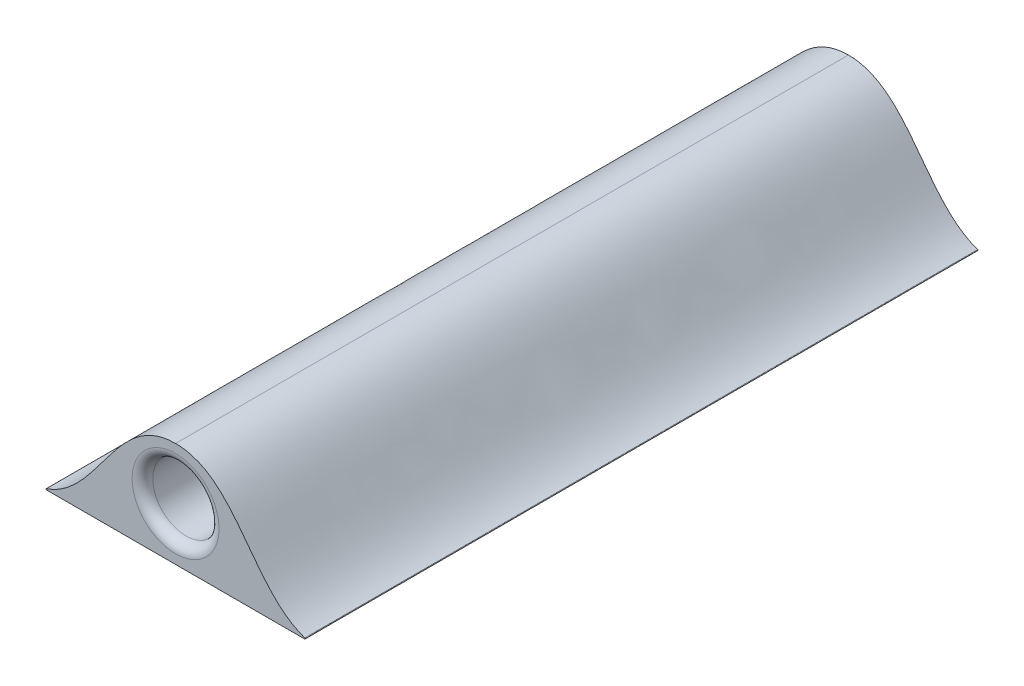
ISO-10303-21;
HEADER;
FILE_DESCRIPTION(('STEP AP214'),'2;1');
FILE_NAME('part.step','',(''),(''),'','','');
FILE_SCHEMA(('AUTOMOTIVE_DESIGN { 1 0 10303 214 1 1 1 1 }'));
ENDSEC;
DATA;
#1=APPLICATION_CONTEXT('core data for automotive mechanical design processes');
#2=APPLICATION_PROTOCOL_DEFINITION('international standard','automotive_design',2000,#1);
#3=PRODUCT_CONTEXT('',#1,'mechanical');
#4=PRODUCT('Part','Part','',(#3));
#5=PRODUCT_RELATED_PRODUCT_CATEGORY('part','',(#4));
#6=PRODUCT_DEFINITION_FORMATION('','',#4);
#7=PRODUCT_DEFINITION_CONTEXT('part definition',#1,'design');
#8=PRODUCT_DEFINITION('design','',#6,#7);
#9=PRODUCT_DEFINITION_SHAPE('','',#8);
#10=(LENGTH_UNIT() NAMED_UNIT(*) SI_UNIT(.MILLI.,.METRE.));
#11=(NAMED_UNIT(*) PLANE_ANGLE_UNIT() SI_UNIT($,.RADIAN.));
#12=(NAMED_UNIT(*) SI_UNIT($,.STERADIAN.) SOLID_ANGLE_UNIT());
#13=UNCERTAINTY_MEASURE_WITH_UNIT(LENGTH_MEASURE(1.E-05),#10,'distance_accuracy_value','');
#14=(GEOMETRIC_REPRESENTATION_CONTEXT(3) GLOBAL_UNCERTAINTY_ASSIGNED_CONTEXT((#13)) GLOBAL_UNIT_ASSIGNED_CONTEXT((#10,
#11,#12)) REPRESENTATION_CONTEXT('',''));
#15=CARTESIAN_POINT('',(0.,0.,0.));
#16=DIRECTION('',(0.,0.,1.));
#17=DIRECTION('',(1.,0.,0.));
#18=AXIS2_PLACEMENT_3D('',#15,#16,#17);
#19=CARTESIAN_POINT('',(-3.36150048232049,0.269129971271316,33.));
#20=DIRECTION('',(0.,0.,-1.));
#21=DIRECTION('',(-1.,0.,0.));
#22=AXIS2_PLACEMENT_3D('',#19,#20,#21);
#23=PLANE('',#22);
#24=CARTESIAN_POINT('',(0.,0.,33.));
#25=DIRECTION('',(0.,0.,-1.));
#26=DIRECTION('',(-1.,0.,0.));
#27=AXIS2_PLACEMENT_3D('',#24,#25,#26);
#28=CIRCLE('',#27,2.133);
#29=CARTESIAN_POINT('',(-2.133,0.,33.));
#30=VERTEX_POINT('',#29);
#31=EDGE_CURVE('E11',#30,#30,#28,.T.);
#32=ORIENTED_EDGE('',*,*,#31,.T.);
#33=EDGE_LOOP('',(#32));
#34=FACE_BOUND('',#33,.T.);
#35=CARTESIAN_POINT('',(0.,2.55568181818182,33.));
#36=CARTESIAN_POINT('',(-3.03666175933934,2.55568181818182,33.));
#37=CARTESIAN_POINT('',(-3.76067286018196,-1.82815340994316,33.));
#38=CARTESIAN_POINT('',(-6.5,-2.58522727272728,33.));
#39=B_SPLINE_CURVE_WITH_KNOTS('',3,(#35,#36,#37,#38),.UNSPECIFIED.,.F.,.F.,(4,4),(0.,1.),.UNSPECIFIED.);
#40=CARTESIAN_POINT('',(0.,2.55568181818182,33.));
#41=VERTEX_POINT('',#40);
#42=CARTESIAN_POINT('',(-6.33875525759955,-2.53576175067591,33.));
#43=VERTEX_POINT('',#42);
#44=EDGE_CURVE('E169',#41,#43,#39,.T.);
#45=ORIENTED_EDGE('',*,*,#44,.T.);
#46=CARTESIAN_POINT('',(-6.33063056385791,-2.55982727272727,33.));
#47=DIRECTION('',(0.,0.,-1.));
#48=DIRECTION('',(-1.,0.,0.));
#49=AXIS2_PLACEMENT_3D('',#46,#47,#48);
#50=CIRCLE('',#49,0.0254);
#51=CARTESIAN_POINT('',(-6.33063056385791,-2.58522727272728,33.));
#52=VERTEX_POINT('',#51);
#53=EDGE_CURVE('E267',#43,#52,#50,.F.);
#54=ORIENTED_EDGE('',*,*,#53,.T.);
#55=DIRECTION('',(1.,0.,0.));
#56=VECTOR('',#55,1.);
#57=CARTESIAN_POINT('',(-6.5,-2.58522727272728,33.));
#58=LINE('',#57,#56);
#59=CARTESIAN_POINT('',(6.33063056385791,-2.58522727272728,33.));
#60=VERTEX_POINT('',#59);
#61=EDGE_CURVE('E175',#52,#60,#58,.T.);
#62=ORIENTED_EDGE('',*,*,#61,.T.);
#63=CARTESIAN_POINT('',(6.33063056385792,-2.55982727272728,33.));
#64=DIRECTION('',(0.,0.,-1.));
#65=DIRECTION('',(-1.,0.,0.));
#66=AXIS2_PLACEMENT_3D('',#63,#64,#65);
#67=CIRCLE('',#66,0.0254);
#68=CARTESIAN_POINT('',(6.33875525760247,-2.5357617506769,33.));
#69=VERTEX_POINT('',#68);
#70=EDGE_CURVE('E55',#60,#69,#67,.F.);
#71=ORIENTED_EDGE('',*,*,#70,.T.);
#72=CARTESIAN_POINT('',(6.5,-2.58522727272728,33.));
#73=CARTESIAN_POINT('',(3.76067286018197,-1.82815340994316,33.));
#74=CARTESIAN_POINT('',(3.03666175933933,2.55568181818182,33.));
#75=CARTESIAN_POINT('',(0.,2.55568181818182,33.));
#76=B_SPLINE_CURVE_WITH_KNOTS('',3,(#72,#73,#74,#75),.UNSPECIFIED.,.F.,.F.,(4,4),(0.,1.),.UNSPECIFIED.);
#77=EDGE_CURVE('E219',#69,#41,#76,.T.);
#78=ORIENTED_EDGE('',*,*,#77,.T.);
#79=EDGE_LOOP('',(#45,#54,#62,#71,#78));
#80=FACE_BOUND('',#79,.T.);
#81=ADVANCED_FACE('F39',(#34,#80),#23,.F.);
#82=CARTESIAN_POINT('',(-3.36150048232049,0.269129971271316,0.));
#83=DIRECTION('',(0.,0.,-1.));
#84=DIRECTION('',(-1.,0.,0.));
#85=AXIS2_PLACEMENT_3D('',#82,#83,#84);
#86=PLANE('',#85);
#87=CARTESIAN_POINT('',(0.,0.,0.));
#88=DIRECTION('',(0.,0.,-1.));
#89=DIRECTION('',(-1.,0.,0.));
#90=AXIS2_PLACEMENT_3D('',#87,#88,#89);
#91=CIRCLE('',#90,2.133);
#92=CARTESIAN_POINT('',(-2.133,0.,0.));
#93=VERTEX_POINT('',#92);
#94=EDGE_CURVE('E274',#93,#93,#91,.F.);
#95=ORIENTED_EDGE('',*,*,#94,.T.);
#96=EDGE_LOOP('',(#95));
#97=FACE_BOUND('',#96,.T.);
#98=DIRECTION('',(1.,0.,0.));
#99=VECTOR('',#98,1.);
#100=CARTESIAN_POINT('',(-6.5,-2.58522727272728,0.));
#101=LINE('',#100,#99);
#102=CARTESIAN_POINT('',(-6.33063056385791,-2.58522727272728,0.));
#103=VERTEX_POINT('',#102);
#104=CARTESIAN_POINT('',(6.33063056385791,-2.58522727272728,0.));
#105=VERTEX_POINT('',#104);
#106=EDGE_CURVE('E233',#103,#105,#101,.T.);
#107=ORIENTED_EDGE('',*,*,#106,.F.);
#108=CARTESIAN_POINT('',(-6.33063056385791,-2.55982727272727,0.));
#109=DIRECTION('',(0.,0.,-1.));
#110=DIRECTION('',(-1.,0.,0.));
#111=AXIS2_PLACEMENT_3D('',#108,#109,#110);
#112=CIRCLE('',#111,0.0254);
#113=CARTESIAN_POINT('',(-6.33875525759955,-2.53576175067591,0.));
#114=VERTEX_POINT('',#113);
#115=EDGE_CURVE('E260',#103,#114,#112,.T.);
#116=ORIENTED_EDGE('',*,*,#115,.T.);
#117=CARTESIAN_POINT('',(0.,2.55568181818182,0.));
#118=CARTESIAN_POINT('',(-3.03666175933934,2.55568181818182,0.));
#119=CARTESIAN_POINT('',(-3.76067286018196,-1.82815340994316,0.));
#120=CARTESIAN_POINT('',(-6.5,-2.58522727272728,0.));
#121=B_SPLINE_CURVE_WITH_KNOTS('',3,(#117,#118,#119,#120),.UNSPECIFIED.,.F.,.F.,(4,4),(0.,1.),.UNSPECIFIED.);
#122=CARTESIAN_POINT('',(0.,2.55568181818182,0.));
#123=VERTEX_POINT('',#122);
#124=EDGE_CURVE('E163',#123,#114,#121,.T.);
#125=ORIENTED_EDGE('',*,*,#124,.F.);
#126=CARTESIAN_POINT('',(6.5,-2.58522727272728,0.));
#127=CARTESIAN_POINT('',(3.76067286018197,-1.82815340994316,0.));
#128=CARTESIAN_POINT('',(3.03666175933933,2.55568181818182,0.));
#129=CARTESIAN_POINT('',(0.,2.55568181818182,0.));
#130=B_SPLINE_CURVE_WITH_KNOTS('',3,(#126,#127,#128,#129),.UNSPECIFIED.,.F.,.F.,(4,4),(0.,1.),.UNSPECIFIED.);
#131=CARTESIAN_POINT('',(6.33875525759955,-2.53576175067591,0.));
#132=VERTEX_POINT('',#131);
#133=EDGE_CURVE('E176',#132,#123,#130,.T.);
#134=ORIENTED_EDGE('',*,*,#133,.F.);
#135=CARTESIAN_POINT('',(6.33063056385792,-2.55982727272728,0.));
#136=DIRECTION('',(0.,0.,-1.));
#137=DIRECTION('',(-1.,0.,0.));
#138=AXIS2_PLACEMENT_3D('',#135,#136,#137);
#139=CIRCLE('',#138,0.0254);
#140=EDGE_CURVE('E257',#132,#105,#139,.T.);
#141=ORIENTED_EDGE('',*,*,#140,.T.);
#142=EDGE_LOOP('',(#107,#116,#125,#134,#141));
#143=FACE_BOUND('',#142,.T.);
#144=ADVANCED_FACE('F187',(#97,#143),#86,.T.);
#145=DIRECTION('',(0.,0.,-1.));
#146=VECTOR('',#145,1.);
#147=SURFACE_OF_LINEAR_EXTRUSION('',#39,#146);
#148=ORIENTED_EDGE('',*,*,#124,.T.);
#149=DIRECTION('',(0.,0.,-1.));
#150=VECTOR('',#149,1.);
#151=CARTESIAN_POINT('',(-6.33875525759948,-2.53576175067589,0.));
#152=LINE('',#151,#150);
#153=EDGE_CURVE('E63',#114,#43,#152,.F.);
#154=ORIENTED_EDGE('',*,*,#153,.T.);
#155=ORIENTED_EDGE('',*,*,#44,.F.);
#156=DIRECTION('',(0.,0.,-1.));
#157=VECTOR('',#156,1.);
#158=CARTESIAN_POINT('',(0.,2.55568181818182,33.));
#159=LINE('',#158,#157);
#160=EDGE_CURVE('E225',#41,#123,#159,.T.);
#161=ORIENTED_EDGE('',*,*,#160,.T.);
#162=EDGE_LOOP('',(#148,#154,#155,#161));
#163=FACE_BOUND('',#162,.T.);
#164=ADVANCED_FACE('F182',(#163),#147,.F.);
#165=CARTESIAN_POINT('',(-6.5,-2.58522727272728,33.));
#166=DIRECTION('',(0.,1.,0.));
#167=DIRECTION('',(0.,0.,1.));
#168=AXIS2_PLACEMENT_3D('',#165,#166,#167);
#169=PLANE('',#168);
#170=DIRECTION('',(1.,0.,0.));
#171=VECTOR('',#170,1.);
#172=CARTESIAN_POINT('',(-5.357,-2.58522727272728,1.143));
#173=LINE('',#172,#171);
#174=CARTESIAN_POINT('',(-5.357,-2.58522727272728,1.143));
#175=VERTEX_POINT('',#174);
#176=CARTESIAN_POINT('',(5.357,-2.58522727272728,1.143));
#177=VERTEX_POINT('',#176);
#178=EDGE_CURVE('E154',#175,#177,#173,.T.);
#179=ORIENTED_EDGE('',*,*,#178,.F.);
#180=DIRECTION('',(0.,0.,-1.));
#181=VECTOR('',#180,1.);
#182=CARTESIAN_POINT('',(-5.357,-2.58522727272728,31.857));
#183=LINE('',#182,#181);
#184=CARTESIAN_POINT('',(-5.357,-2.58522727272728,31.857));
#185=VERTEX_POINT('',#184);
#186=EDGE_CURVE('E121',#185,#175,#183,.T.);
#187=ORIENTED_EDGE('',*,*,#186,.F.);
#188=DIRECTION('',(-1.,0.,0.));
#189=VECTOR('',#188,1.);
#190=CARTESIAN_POINT('',(5.357,-2.58522727272728,31.857));
#191=LINE('',#190,#189);
#192=CARTESIAN_POINT('',(5.357,-2.58522727272728,31.857));
#193=VERTEX_POINT('',#192);
#194=EDGE_CURVE('E141',#193,#185,#191,.T.);
#195=ORIENTED_EDGE('',*,*,#194,.F.);
#196=DIRECTION('',(0.,0.,1.));
#197=VECTOR('',#196,1.);
#198=CARTESIAN_POINT('',(5.357,-2.58522727272728,1.143));
#199=LINE('',#198,#197);
#200=EDGE_CURVE('E145',#177,#193,#199,.T.);
#201=ORIENTED_EDGE('',*,*,#200,.F.);
#202=EDGE_LOOP('',(#179,#187,#195,#201));
#203=FACE_BOUND('',#202,.T.);
#204=ORIENTED_EDGE('',*,*,#61,.F.);
#205=DIRECTION('',(0.,0.,-1.));
#206=VECTOR('',#205,1.);
#207=CARTESIAN_POINT('',(-6.33063056385791,-2.58522727272728,33.));
#208=LINE('',#207,#206);
#209=EDGE_CURVE('E253',#52,#103,#208,.T.);
#210=ORIENTED_EDGE('',*,*,#209,.T.);
#211=ORIENTED_EDGE('',*,*,#106,.T.);
#212=DIRECTION('',(0.,0.,-1.));
#213=VECTOR('',#212,1.);
#214=CARTESIAN_POINT('',(6.33063056385792,-2.58522727272728,33.));
#215=LINE('',#214,#213);
#216=EDGE_CURVE('E250',#105,#60,#215,.F.);
#217=ORIENTED_EDGE('',*,*,#216,.T.);
#218=EDGE_LOOP('',(#204,#210,#211,#217));
#219=FACE_BOUND('',#218,.T.);
#220=ADVANCED_FACE('F186',(#203,#219),#169,.F.);
#221=DIRECTION('',(0.,0.,-1.));
#222=VECTOR('',#221,1.);
#223=SURFACE_OF_LINEAR_EXTRUSION('',#76,#222);
#224=ORIENTED_EDGE('',*,*,#77,.F.);
#225=DIRECTION('',(0.,0.,-1.));
#226=VECTOR('',#225,1.);
#227=CARTESIAN_POINT('',(6.33875525759949,-2.53576175067589,33.));
#228=LINE('',#227,#226);
#229=EDGE_CURVE('E270',#69,#132,#228,.T.);
#230=ORIENTED_EDGE('',*,*,#229,.T.);
#231=ORIENTED_EDGE('',*,*,#133,.T.);
#232=ORIENTED_EDGE('',*,*,#160,.F.);
#233=EDGE_LOOP('',(#224,#230,#231,#232));
#234=FACE_BOUND('',#233,.T.);
#235=ADVANCED_FACE('F216',(#234),#223,.F.);
#236=CARTESIAN_POINT('',(0.,0.,33.));
#237=DIRECTION('',(0.,0.,-1.));
#238=DIRECTION('',(-1.,0.,0.));
#239=AXIS2_PLACEMENT_3D('',#236,#237,#238);
#240=CYLINDRICAL_SURFACE('',#239,1.625);
#241=CARTESIAN_POINT('',(0.,0.,0.508000000000002));
#242=DIRECTION('',(0.,0.,-1.));
#243=DIRECTION('',(-1.,0.,0.));
#244=AXIS2_PLACEMENT_3D('',#241,#242,#243);
#245=CIRCLE('',#244,1.625);
#246=CARTESIAN_POINT('',(-1.625,0.,0.508000000000002));
#247=VERTEX_POINT('',#246);
#248=EDGE_CURVE('E48',#247,#247,#245,.T.);
#249=ORIENTED_EDGE('',*,*,#248,.T.);
#250=EDGE_LOOP('',(#249));
#251=FACE_BOUND('',#250,.T.);
#252=CARTESIAN_POINT('',(0.,0.,32.492));
#253=DIRECTION('',(0.,0.,-1.));
#254=DIRECTION('',(-1.,0.,0.));
#255=AXIS2_PLACEMENT_3D('',#252,#253,#254);
#256=CIRCLE('',#255,1.625);
#257=CARTESIAN_POINT('',(-1.625,0.,32.492));
#258=VERTEX_POINT('',#257);
#259=EDGE_CURVE('E278',#258,#258,#256,.F.);
#260=ORIENTED_EDGE('',*,*,#259,.T.);
#261=EDGE_LOOP('',(#260));
#262=FACE_BOUND('',#261,.T.);
#263=ADVANCED_FACE('F214',(#251,#262),#240,.F.);
#264=CARTESIAN_POINT('',(-5.357,-2.08522727272728,31.857));
#265=DIRECTION('',(-1.,0.,0.));
#266=DIRECTION('',(0.,0.,1.));
#267=AXIS2_PLACEMENT_3D('',#264,#265,#266);
#268=PLANE('',#267);
#269=ORIENTED_EDGE('',*,*,#186,.T.);
#270=DIRECTION('',(0.,-1.,0.));
#271=VECTOR('',#270,1.);
#272=CARTESIAN_POINT('',(-5.357,-2.08522727272728,1.143));
#273=LINE('',#272,#271);
#274=CARTESIAN_POINT('',(-5.357,-2.08522727272728,1.143));
#275=VERTEX_POINT('',#274);
#276=EDGE_CURVE('E114',#275,#175,#273,.T.);
#277=ORIENTED_EDGE('',*,*,#276,.F.);
#278=DIRECTION('',(0.,0.,-1.));
#279=VECTOR('',#278,1.);
#280=CARTESIAN_POINT('',(-5.357,-2.08522727272728,31.857));
#281=LINE('',#280,#279);
#282=CARTESIAN_POINT('',(-5.357,-2.08522727272728,31.857));
#283=VERTEX_POINT('',#282);
#284=EDGE_CURVE('E118',#283,#275,#281,.T.);
#285=ORIENTED_EDGE('',*,*,#284,.F.);
#286=DIRECTION('',(0.,-1.,0.));
#287=VECTOR('',#286,1.);
#288=CARTESIAN_POINT('',(-5.357,-2.08522727272728,31.857));
#289=LINE('',#288,#287);
#290=EDGE_CURVE('E160',#283,#185,#289,.T.);
#291=ORIENTED_EDGE('',*,*,#290,.T.);
#292=EDGE_LOOP('',(#269,#277,#285,#291));
#293=FACE_BOUND('',#292,.T.);
#294=ADVANCED_FACE('F116',(#293),#268,.F.);
#295=CARTESIAN_POINT('',(5.357,-2.08522727272728,31.857));
#296=DIRECTION('',(0.,0.,1.));
#297=DIRECTION('',(1.,0.,0.));
#298=AXIS2_PLACEMENT_3D('',#295,#296,#297);
#299=PLANE('',#298);
#300=ORIENTED_EDGE('',*,*,#194,.T.);
#301=ORIENTED_EDGE('',*,*,#290,.F.);
#302=DIRECTION('',(-1.,0.,0.));
#303=VECTOR('',#302,1.);
#304=CARTESIAN_POINT('',(5.357,-2.08522727272728,31.857));
#305=LINE('',#304,#303);
#306=CARTESIAN_POINT('',(5.357,-2.08522727272728,31.857));
#307=VERTEX_POINT('',#306);
#308=EDGE_CURVE('E127',#307,#283,#305,.T.);
#309=ORIENTED_EDGE('',*,*,#308,.F.);
#310=DIRECTION('',(0.,-1.,0.));
#311=VECTOR('',#310,1.);
#312=CARTESIAN_POINT('',(5.357,-2.08522727272728,31.857));
#313=LINE('',#312,#311);
#314=EDGE_CURVE('E164',#307,#193,#313,.T.);
#315=ORIENTED_EDGE('',*,*,#314,.T.);
#316=EDGE_LOOP('',(#300,#301,#309,#315));
#317=FACE_BOUND('',#316,.T.);
#318=ADVANCED_FACE('F291',(#317),#299,.F.);
#319=CARTESIAN_POINT('',(5.357,-2.08522727272728,1.143));
#320=DIRECTION('',(1.,0.,0.));
#321=DIRECTION('',(0.,0.,-1.));
#322=AXIS2_PLACEMENT_3D('',#319,#320,#321);
#323=PLANE('',#322);
#324=ORIENTED_EDGE('',*,*,#200,.T.);
#325=ORIENTED_EDGE('',*,*,#314,.F.);
#326=DIRECTION('',(0.,0.,1.));
#327=VECTOR('',#326,1.);
#328=CARTESIAN_POINT('',(5.357,-2.08522727272728,1.143));
#329=LINE('',#328,#327);
#330=CARTESIAN_POINT('',(5.357,-2.08522727272728,1.143));
#331=VERTEX_POINT('',#330);
#332=EDGE_CURVE('E136',#331,#307,#329,.T.);
#333=ORIENTED_EDGE('',*,*,#332,.F.);
#334=DIRECTION('',(0.,-1.,0.));
#335=VECTOR('',#334,1.);
#336=CARTESIAN_POINT('',(5.357,-2.08522727272728,1.143));
#337=LINE('',#336,#335);
#338=EDGE_CURVE('E126',#331,#177,#337,.T.);
#339=ORIENTED_EDGE('',*,*,#338,.T.);
#340=EDGE_LOOP('',(#324,#325,#333,#339));
#341=FACE_BOUND('',#340,.T.);
#342=ADVANCED_FACE('F295',(#341),#323,.F.);
#343=CARTESIAN_POINT('',(-5.357,-2.08522727272728,1.143));
#344=DIRECTION('',(0.,0.,-1.));
#345=DIRECTION('',(-1.,0.,0.));
#346=AXIS2_PLACEMENT_3D('',#343,#344,#345);
#347=PLANE('',#346);
#348=ORIENTED_EDGE('',*,*,#178,.T.);
#349=ORIENTED_EDGE('',*,*,#338,.F.);
#350=DIRECTION('',(1.,0.,0.));
#351=VECTOR('',#350,1.);
#352=CARTESIAN_POINT('',(-5.357,-2.08522727272728,1.143));
#353=LINE('',#352,#351);
#354=EDGE_CURVE('E130',#275,#331,#353,.T.);
#355=ORIENTED_EDGE('',*,*,#354,.F.);
#356=ORIENTED_EDGE('',*,*,#276,.T.);
#357=EDGE_LOOP('',(#348,#349,#355,#356));
#358=FACE_BOUND('',#357,.T.);
#359=ADVANCED_FACE('F131',(#358),#347,.F.);
#360=CARTESIAN_POINT('',(0.,-2.08522727272728,0.));
#361=DIRECTION('',(0.,-1.,0.));
#362=DIRECTION('',(0.,0.,-1.));
#363=AXIS2_PLACEMENT_3D('',#360,#361,#362);
#364=PLANE('',#363);
#365=ORIENTED_EDGE('',*,*,#284,.T.);
#366=ORIENTED_EDGE('',*,*,#354,.T.);
#367=ORIENTED_EDGE('',*,*,#332,.T.);
#368=ORIENTED_EDGE('',*,*,#308,.T.);
#369=EDGE_LOOP('',(#365,#366,#367,#368));
#370=FACE_BOUND('',#369,.T.);
#371=ADVANCED_FACE('F138',(#370),#364,.T.);
#372=CARTESIAN_POINT('',(-6.33063056385791,-2.55982727272727,16.5));
#373=DIRECTION('',(0.,0.,-1.));
#374=DIRECTION('',(-1.,0.,0.));
#375=AXIS2_PLACEMENT_3D('',#372,#373,#374);
#376=CYLINDRICAL_SURFACE('',#375,0.0254);
#377=ORIENTED_EDGE('',*,*,#53,.F.);
#378=ORIENTED_EDGE('',*,*,#153,.F.);
#379=ORIENTED_EDGE('',*,*,#115,.F.);
#380=ORIENTED_EDGE('',*,*,#209,.F.);
#381=EDGE_LOOP('',(#377,#378,#379,#380));
#382=FACE_BOUND('',#381,.T.);
#383=ADVANCED_FACE('F189',(#382),#376,.T.);
#384=CARTESIAN_POINT('',(6.33063056385792,-2.55982727272728,16.5));
#385=DIRECTION('',(0.,0.,-1.));
#386=DIRECTION('',(-1.,0.,0.));
#387=AXIS2_PLACEMENT_3D('',#384,#385,#386);
#388=CYLINDRICAL_SURFACE('',#387,0.0254);
#389=ORIENTED_EDGE('',*,*,#70,.F.);
#390=ORIENTED_EDGE('',*,*,#216,.F.);
#391=ORIENTED_EDGE('',*,*,#140,.F.);
#392=ORIENTED_EDGE('',*,*,#229,.F.);
#393=EDGE_LOOP('',(#389,#390,#391,#392));
#394=FACE_BOUND('',#393,.T.);
#395=ADVANCED_FACE('F192',(#394),#388,.T.);
#396=CARTESIAN_POINT('',(0.,0.,0.508000000000002));
#397=DIRECTION('',(0.,0.,-1.));
#398=DIRECTION('',(-1.,0.,0.));
#399=AXIS2_PLACEMENT_3D('',#396,#397,#398);
#400=TOROIDAL_SURFACE('',#399,2.133,0.508);
#401=ORIENTED_EDGE('',*,*,#248,.F.);
#402=EDGE_LOOP('',(#401));
#403=FACE_BOUND('',#402,.T.);
#404=ORIENTED_EDGE('',*,*,#94,.F.);
#405=EDGE_LOOP('',(#404));
#406=FACE_BOUND('',#405,.T.);
#407=ADVANCED_FACE('F195',(#403,#406),#400,.T.);
#408=CARTESIAN_POINT('',(0.,0.,32.492));
#409=DIRECTION('',(0.,0.,-1.));
#410=DIRECTION('',(-1.,0.,0.));
#411=AXIS2_PLACEMENT_3D('',#408,#409,#410);
#412=TOROIDAL_SURFACE('',#411,2.133,0.508);
#413=ORIENTED_EDGE('',*,*,#31,.F.);
#414=EDGE_LOOP('',(#413));
#415=FACE_BOUND('',#414,.T.);
#416=ORIENTED_EDGE('',*,*,#259,.F.);
#417=EDGE_LOOP('',(#416));
#418=FACE_BOUND('',#417,.T.);
#419=ADVANCED_FACE('F41',(#415,#418),#412,.T.);
#420=CLOSED_SHELL('',(#81,#144,#164,#220,#235,#263,#294,#318,#342,#359,#371,#383,#395,#407,#419));
#421=MANIFOLD_SOLID_BREP('B2',#420);
#422=ADVANCED_BREP_SHAPE_REPRESENTATION('',(#18,#421),#14);
#423=SHAPE_DEFINITION_REPRESENTATION(#9,#422);
ENDSEC;
END-ISO-10303-21;
